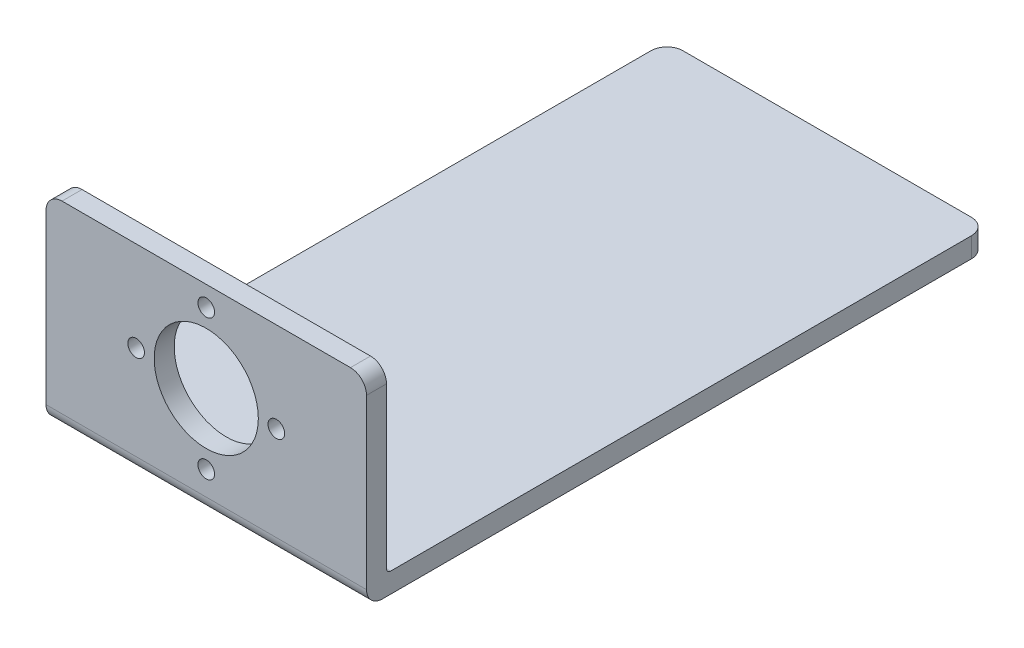
ISO-10303-21;
HEADER;
FILE_DESCRIPTION(('STEP AP214'),'2;1');
FILE_NAME('part.step','',(''),(''),'','','');
FILE_SCHEMA(('AUTOMOTIVE_DESIGN { 1 0 10303 214 1 1 1 1 }'));
ENDSEC;
DATA;
#1=APPLICATION_CONTEXT('core data for automotive mechanical design processes');
#2=APPLICATION_PROTOCOL_DEFINITION('international standard','automotive_design',2000,#1);
#3=PRODUCT_CONTEXT('',#1,'mechanical');
#4=PRODUCT('Part','Part','',(#3));
#5=PRODUCT_RELATED_PRODUCT_CATEGORY('part','',(#4));
#6=PRODUCT_DEFINITION_FORMATION('','',#4);
#7=PRODUCT_DEFINITION_CONTEXT('part definition',#1,'design');
#8=PRODUCT_DEFINITION('design','',#6,#7);
#9=PRODUCT_DEFINITION_SHAPE('','',#8);
#10=(LENGTH_UNIT() NAMED_UNIT(*) SI_UNIT(.MILLI.,.METRE.));
#11=(NAMED_UNIT(*) PLANE_ANGLE_UNIT() SI_UNIT($,.RADIAN.));
#12=(NAMED_UNIT(*) SI_UNIT($,.STERADIAN.) SOLID_ANGLE_UNIT());
#13=UNCERTAINTY_MEASURE_WITH_UNIT(LENGTH_MEASURE(1.E-05),#10,'distance_accuracy_value','');
#14=(GEOMETRIC_REPRESENTATION_CONTEXT(3) GLOBAL_UNCERTAINTY_ASSIGNED_CONTEXT((#13)) GLOBAL_UNIT_ASSIGNED_CONTEXT((#10,
#11,#12)) REPRESENTATION_CONTEXT('',''));
#15=CARTESIAN_POINT('',(0.,0.,0.));
#16=DIRECTION('',(0.,0.,1.));
#17=DIRECTION('',(1.,0.,0.));
#18=AXIS2_PLACEMENT_3D('',#15,#16,#17);
#19=CARTESIAN_POINT('',(0.,0.,5.));
#20=DIRECTION('',(0.,0.,-1.));
#21=DIRECTION('',(-1.,0.,0.));
#22=AXIS2_PLACEMENT_3D('',#19,#20,#21);
#23=PLANE('',#22);
#24=DIRECTION('',(0.,-1.,0.));
#25=VECTOR('',#24,1.);
#26=CARTESIAN_POINT('',(-40.,-22.5,5.));
#27=LINE('',#26,#25);
#28=CARTESIAN_POINT('',(-40.,18.5,5.));
#29=VERTEX_POINT('',#28);
#30=CARTESIAN_POINT('',(-40.,-23.5,5.));
#31=VERTEX_POINT('',#30);
#32=EDGE_CURVE('E195',#29,#31,#27,.T.);
#33=ORIENTED_EDGE('',*,*,#32,.T.);
#34=DIRECTION('',(-1.,0.,0.));
#35=VECTOR('',#34,1.);
#36=CARTESIAN_POINT('',(40.,-23.5,5.));
#37=LINE('',#36,#35);
#38=CARTESIAN_POINT('',(40.,-23.5,5.));
#39=VERTEX_POINT('',#38);
#40=EDGE_CURVE('E128',#31,#39,#37,.F.);
#41=ORIENTED_EDGE('',*,*,#40,.T.);
#42=DIRECTION('',(0.,1.,0.));
#43=VECTOR('',#42,1.);
#44=CARTESIAN_POINT('',(40.,-22.5,5.));
#45=LINE('',#44,#43);
#46=CARTESIAN_POINT('',(40.,18.5,5.));
#47=VERTEX_POINT('',#46);
#48=EDGE_CURVE('E188',#39,#47,#45,.T.);
#49=ORIENTED_EDGE('',*,*,#48,.T.);
#50=CARTESIAN_POINT('',(36.,18.5,5.));
#51=DIRECTION('',(0.,0.,-1.));
#52=DIRECTION('',(-1.,0.,0.));
#53=AXIS2_PLACEMENT_3D('',#50,#51,#52);
#54=CIRCLE('',#53,4.);
#55=CARTESIAN_POINT('',(36.,22.5,5.));
#56=VERTEX_POINT('',#55);
#57=EDGE_CURVE('E133',#47,#56,#54,.F.);
#58=ORIENTED_EDGE('',*,*,#57,.T.);
#59=DIRECTION('',(-1.,0.,0.));
#60=VECTOR('',#59,1.);
#61=CARTESIAN_POINT('',(-40.,22.5,5.));
#62=LINE('',#61,#60);
#63=CARTESIAN_POINT('',(-36.,22.5,5.));
#64=VERTEX_POINT('',#63);
#65=EDGE_CURVE('E191',#56,#64,#62,.T.);
#66=ORIENTED_EDGE('',*,*,#65,.T.);
#67=CARTESIAN_POINT('',(-36.,18.5,5.));
#68=DIRECTION('',(0.,0.,-1.));
#69=DIRECTION('',(-1.,0.,0.));
#70=AXIS2_PLACEMENT_3D('',#67,#68,#69);
#71=CIRCLE('',#70,4.);
#72=EDGE_CURVE('E209',#64,#29,#71,.F.);
#73=ORIENTED_EDGE('',*,*,#72,.T.);
#74=EDGE_LOOP('',(#33,#41,#49,#58,#66,#73));
#75=FACE_BOUND('',#74,.T.);
#76=CARTESIAN_POINT('',(0.,0.,5.));
#77=DIRECTION('',(0.,0.,1.));
#78=DIRECTION('',(1.,0.,0.));
#79=AXIS2_PLACEMENT_3D('',#76,#77,#78);
#80=CIRCLE('',#79,13.);
#81=CARTESIAN_POINT('',(13.,0.,5.));
#82=VERTEX_POINT('',#81);
#83=EDGE_CURVE('E182',#82,#82,#80,.T.);
#84=ORIENTED_EDGE('',*,*,#83,.F.);
#85=EDGE_LOOP('',(#84));
#86=FACE_BOUND('',#85,.T.);
#87=CARTESIAN_POINT('',(0.,17.5,5.));
#88=DIRECTION('',(0.,0.,1.));
#89=DIRECTION('',(1.,0.,0.));
#90=AXIS2_PLACEMENT_3D('',#87,#88,#89);
#91=CIRCLE('',#90,2.075);
#92=CARTESIAN_POINT('',(2.075,17.5,5.));
#93=VERTEX_POINT('',#92);
#94=EDGE_CURVE('E176',#93,#93,#91,.T.);
#95=ORIENTED_EDGE('',*,*,#94,.F.);
#96=EDGE_LOOP('',(#95));
#97=FACE_BOUND('',#96,.T.);
#98=CARTESIAN_POINT('',(17.5000000000005,4.95450781852964E-13,5.));
#99=DIRECTION('',(0.,0.,1.));
#100=DIRECTION('',(1.,0.,0.));
#101=AXIS2_PLACEMENT_3D('',#98,#99,#100);
#102=CIRCLE('',#101,2.07500000000038);
#103=CARTESIAN_POINT('',(19.5750000000009,4.95450781852964E-13,5.));
#104=VERTEX_POINT('',#103);
#105=EDGE_CURVE('E170',#104,#104,#102,.T.);
#106=ORIENTED_EDGE('',*,*,#105,.F.);
#107=EDGE_LOOP('',(#106));
#108=FACE_BOUND('',#107,.T.);
#109=CARTESIAN_POINT('',(9.84838511209777E-13,-17.5,5.));
#110=DIRECTION('',(0.,0.,1.));
#111=DIRECTION('',(1.,0.,0.));
#112=AXIS2_PLACEMENT_3D('',#109,#110,#111);
#113=CIRCLE('',#112,2.07500000000105);
#114=CARTESIAN_POINT('',(2.07500000000204,-17.5,5.));
#115=VERTEX_POINT('',#114);
#116=EDGE_CURVE('E164',#115,#115,#113,.T.);
#117=ORIENTED_EDGE('',*,*,#116,.F.);
#118=EDGE_LOOP('',(#117));
#119=FACE_BOUND('',#118,.T.);
#120=CARTESIAN_POINT('',(-17.4999999999995,-4.97593913751471E-13,5.));
#121=DIRECTION('',(0.,0.,1.));
#122=DIRECTION('',(1.,0.,0.));
#123=AXIS2_PLACEMENT_3D('',#120,#121,#122);
#124=CIRCLE('',#123,2.07500000000078);
#125=CARTESIAN_POINT('',(-15.4249999999987,-4.97593913751471E-13,5.));
#126=VERTEX_POINT('',#125);
#127=EDGE_CURVE('E157',#126,#126,#124,.T.);
#128=ORIENTED_EDGE('',*,*,#127,.F.);
#129=EDGE_LOOP('',(#128));
#130=FACE_BOUND('',#129,.T.);
#131=ADVANCED_FACE('F35',(#75,#86,#97,#108,#119,#130),#23,.F.);
#132=CARTESIAN_POINT('',(0.,0.,0.));
#133=DIRECTION('',(0.,0.,-1.));
#134=DIRECTION('',(-1.,0.,0.));
#135=AXIS2_PLACEMENT_3D('',#132,#133,#134);
#136=PLANE('',#135);
#137=CARTESIAN_POINT('',(9.84838511209777E-13,-17.5,0.));
#138=DIRECTION('',(0.,0.,1.));
#139=DIRECTION('',(1.,0.,0.));
#140=AXIS2_PLACEMENT_3D('',#137,#138,#139);
#141=CIRCLE('',#140,2.07500000000105);
#142=CARTESIAN_POINT('',(2.07500000000204,-17.5,0.));
#143=VERTEX_POINT('',#142);
#144=EDGE_CURVE('E160',#143,#143,#141,.T.);
#145=ORIENTED_EDGE('',*,*,#144,.T.);
#146=EDGE_LOOP('',(#145));
#147=FACE_BOUND('',#146,.T.);
#148=CARTESIAN_POINT('',(0.,17.5,0.));
#149=DIRECTION('',(0.,0.,1.));
#150=DIRECTION('',(1.,0.,0.));
#151=AXIS2_PLACEMENT_3D('',#148,#149,#150);
#152=CIRCLE('',#151,2.075);
#153=CARTESIAN_POINT('',(2.075,17.5,0.));
#154=VERTEX_POINT('',#153);
#155=EDGE_CURVE('E173',#154,#154,#152,.T.);
#156=ORIENTED_EDGE('',*,*,#155,.T.);
#157=EDGE_LOOP('',(#156));
#158=FACE_BOUND('',#157,.T.);
#159=DIRECTION('',(0.,1.,0.));
#160=VECTOR('',#159,1.);
#161=CARTESIAN_POINT('',(40.,-22.5,0.));
#162=LINE('',#161,#160);
#163=CARTESIAN_POINT('',(40.,-21.5,0.));
#164=VERTEX_POINT('',#163);
#165=CARTESIAN_POINT('',(40.,18.5,0.));
#166=VERTEX_POINT('',#165);
#167=EDGE_CURVE('E185',#164,#166,#162,.T.);
#168=ORIENTED_EDGE('',*,*,#167,.F.);
#169=DIRECTION('',(1.,0.,0.));
#170=VECTOR('',#169,1.);
#171=CARTESIAN_POINT('',(-40.,-21.5,0.));
#172=LINE('',#171,#170);
#173=CARTESIAN_POINT('',(-40.,-21.5,0.));
#174=VERTEX_POINT('',#173);
#175=EDGE_CURVE('E56',#164,#174,#172,.F.);
#176=ORIENTED_EDGE('',*,*,#175,.T.);
#177=DIRECTION('',(0.,-1.,0.));
#178=VECTOR('',#177,1.);
#179=CARTESIAN_POINT('',(-40.,-22.5,0.));
#180=LINE('',#179,#178);
#181=CARTESIAN_POINT('',(-40.,18.5,0.));
#182=VERTEX_POINT('',#181);
#183=EDGE_CURVE('E192',#182,#174,#180,.T.);
#184=ORIENTED_EDGE('',*,*,#183,.F.);
#185=CARTESIAN_POINT('',(-36.,18.5,0.));
#186=DIRECTION('',(0.,0.,-1.));
#187=DIRECTION('',(-1.,0.,0.));
#188=AXIS2_PLACEMENT_3D('',#185,#186,#187);
#189=CIRCLE('',#188,4.);
#190=CARTESIAN_POINT('',(-36.,22.5,0.));
#191=VERTEX_POINT('',#190);
#192=EDGE_CURVE('E222',#182,#191,#189,.T.);
#193=ORIENTED_EDGE('',*,*,#192,.T.);
#194=DIRECTION('',(-1.,0.,0.));
#195=VECTOR('',#194,1.);
#196=CARTESIAN_POINT('',(-40.,22.5,0.));
#197=LINE('',#196,#195);
#198=CARTESIAN_POINT('',(36.,22.5,0.));
#199=VERTEX_POINT('',#198);
#200=EDGE_CURVE('E199',#199,#191,#197,.T.);
#201=ORIENTED_EDGE('',*,*,#200,.F.);
#202=CARTESIAN_POINT('',(36.,18.5,0.));
#203=DIRECTION('',(0.,0.,-1.));
#204=DIRECTION('',(-1.,0.,0.));
#205=AXIS2_PLACEMENT_3D('',#202,#203,#204);
#206=CIRCLE('',#205,4.);
#207=EDGE_CURVE('E219',#199,#166,#206,.T.);
#208=ORIENTED_EDGE('',*,*,#207,.T.);
#209=EDGE_LOOP('',(#168,#176,#184,#193,#201,#208));
#210=FACE_BOUND('',#209,.T.);
#211=CARTESIAN_POINT('',(0.,0.,0.));
#212=DIRECTION('',(0.,0.,1.));
#213=DIRECTION('',(1.,0.,0.));
#214=AXIS2_PLACEMENT_3D('',#211,#212,#213);
#215=CIRCLE('',#214,13.);
#216=CARTESIAN_POINT('',(13.,0.,0.));
#217=VERTEX_POINT('',#216);
#218=EDGE_CURVE('E179',#217,#217,#215,.T.);
#219=ORIENTED_EDGE('',*,*,#218,.T.);
#220=EDGE_LOOP('',(#219));
#221=FACE_BOUND('',#220,.T.);
#222=CARTESIAN_POINT('',(17.5000000000005,4.95450781852964E-13,0.));
#223=DIRECTION('',(0.,0.,1.));
#224=DIRECTION('',(1.,0.,0.));
#225=AXIS2_PLACEMENT_3D('',#222,#223,#224);
#226=CIRCLE('',#225,2.07500000000038);
#227=CARTESIAN_POINT('',(19.5750000000009,4.95450781852964E-13,0.));
#228=VERTEX_POINT('',#227);
#229=EDGE_CURVE('E167',#228,#228,#226,.T.);
#230=ORIENTED_EDGE('',*,*,#229,.T.);
#231=EDGE_LOOP('',(#230));
#232=FACE_BOUND('',#231,.T.);
#233=CARTESIAN_POINT('',(-17.4999999999995,-4.97593913751471E-13,0.));
#234=DIRECTION('',(0.,0.,1.));
#235=DIRECTION('',(1.,0.,0.));
#236=AXIS2_PLACEMENT_3D('',#233,#234,#235);
#237=CIRCLE('',#236,2.07500000000078);
#238=CARTESIAN_POINT('',(-15.4249999999987,-4.97593913751471E-13,0.));
#239=VERTEX_POINT('',#238);
#240=EDGE_CURVE('E161',#239,#239,#237,.T.);
#241=ORIENTED_EDGE('',*,*,#240,.T.);
#242=EDGE_LOOP('',(#241));
#243=FACE_BOUND('',#242,.T.);
#244=ADVANCED_FACE('F280',(#147,#158,#210,#221,#232,#243),#136,.T.);
#245=CARTESIAN_POINT('',(40.,-22.5,5.));
#246=DIRECTION('',(-1.,0.,0.));
#247=DIRECTION('',(0.,0.,1.));
#248=AXIS2_PLACEMENT_3D('',#245,#246,#247);
#249=PLANE('',#248);
#250=ORIENTED_EDGE('',*,*,#48,.F.);
#251=CARTESIAN_POINT('',(40.,-23.5,1.));
#252=DIRECTION('',(-1.,0.,0.));
#253=DIRECTION('',(0.,0.,1.));
#254=AXIS2_PLACEMENT_3D('',#251,#252,#253);
#255=CIRCLE('',#254,4.);
#256=CARTESIAN_POINT('',(40.,-27.5,1.));
#257=VERTEX_POINT('',#256);
#258=EDGE_CURVE('E217',#39,#257,#255,.F.);
#259=ORIENTED_EDGE('',*,*,#258,.T.);
#260=DIRECTION('',(0.,0.,-1.));
#261=VECTOR('',#260,1.);
#262=CARTESIAN_POINT('',(40.,-27.5,5.));
#263=LINE('',#262,#261);
#264=CARTESIAN_POINT('',(40.,-27.5,-146.));
#265=VERTEX_POINT('',#264);
#266=EDGE_CURVE('E143',#257,#265,#263,.T.);
#267=ORIENTED_EDGE('',*,*,#266,.T.);
#268=DIRECTION('',(0.,-1.,0.));
#269=VECTOR('',#268,1.);
#270=CARTESIAN_POINT('',(40.,-22.5,-146.));
#271=LINE('',#270,#269);
#272=CARTESIAN_POINT('',(40.,-22.5,-146.));
#273=VERTEX_POINT('',#272);
#274=EDGE_CURVE('E212',#265,#273,#271,.F.);
#275=ORIENTED_EDGE('',*,*,#274,.T.);
#276=DIRECTION('',(0.,0.,-1.));
#277=VECTOR('',#276,1.);
#278=CARTESIAN_POINT('',(40.,-22.5,5.));
#279=LINE('',#278,#277);
#280=CARTESIAN_POINT('',(40.,-22.5,-1.));
#281=VERTEX_POINT('',#280);
#282=EDGE_CURVE('E151',#281,#273,#279,.T.);
#283=ORIENTED_EDGE('',*,*,#282,.F.);
#284=CARTESIAN_POINT('',(40.,-21.5,-1.));
#285=DIRECTION('',(-1.,0.,0.));
#286=DIRECTION('',(0.,0.,1.));
#287=AXIS2_PLACEMENT_3D('',#284,#285,#286);
#288=CIRCLE('',#287,1.);
#289=EDGE_CURVE('E43',#281,#164,#288,.T.);
#290=ORIENTED_EDGE('',*,*,#289,.T.);
#291=ORIENTED_EDGE('',*,*,#167,.T.);
#292=DIRECTION('',(0.,0.,-1.));
#293=VECTOR('',#292,1.);
#294=CARTESIAN_POINT('',(40.,18.5,5.));
#295=LINE('',#294,#293);
#296=EDGE_CURVE('E215',#166,#47,#295,.F.);
#297=ORIENTED_EDGE('',*,*,#296,.T.);
#298=EDGE_LOOP('',(#250,#259,#267,#275,#283,#290,#291,#297));
#299=FACE_BOUND('',#298,.T.);
#300=ADVANCED_FACE('F250',(#299),#249,.F.);
#301=CARTESIAN_POINT('',(-40.,22.5,5.));
#302=DIRECTION('',(0.,-1.,0.));
#303=DIRECTION('',(0.,0.,-1.));
#304=AXIS2_PLACEMENT_3D('',#301,#302,#303);
#305=PLANE('',#304);
#306=ORIENTED_EDGE('',*,*,#200,.T.);
#307=DIRECTION('',(0.,0.,-1.));
#308=VECTOR('',#307,1.);
#309=CARTESIAN_POINT('',(-36.,22.5,5.));
#310=LINE('',#309,#308);
#311=EDGE_CURVE('E227',#191,#64,#310,.F.);
#312=ORIENTED_EDGE('',*,*,#311,.T.);
#313=ORIENTED_EDGE('',*,*,#65,.F.);
#314=DIRECTION('',(0.,0.,-1.));
#315=VECTOR('',#314,1.);
#316=CARTESIAN_POINT('',(36.,22.5,5.));
#317=LINE('',#316,#315);
#318=EDGE_CURVE('E224',#56,#199,#317,.T.);
#319=ORIENTED_EDGE('',*,*,#318,.T.);
#320=EDGE_LOOP('',(#306,#312,#313,#319));
#321=FACE_BOUND('',#320,.T.);
#322=ADVANCED_FACE('F278',(#321),#305,.F.);
#323=CARTESIAN_POINT('',(-40.,-22.5,5.));
#324=DIRECTION('',(1.,0.,0.));
#325=DIRECTION('',(0.,0.,-1.));
#326=AXIS2_PLACEMENT_3D('',#323,#324,#325);
#327=PLANE('',#326);
#328=DIRECTION('',(0.,0.,-1.));
#329=VECTOR('',#328,1.);
#330=CARTESIAN_POINT('',(-40.,-27.5,5.));
#331=LINE('',#330,#329);
#332=CARTESIAN_POINT('',(-40.,-27.5,1.));
#333=VERTEX_POINT('',#332);
#334=CARTESIAN_POINT('',(-40.,-27.5,-146.));
#335=VERTEX_POINT('',#334);
#336=EDGE_CURVE('E140',#333,#335,#331,.T.);
#337=ORIENTED_EDGE('',*,*,#336,.F.);
#338=CARTESIAN_POINT('',(-40.,-23.5,1.));
#339=DIRECTION('',(1.,0.,0.));
#340=DIRECTION('',(0.,0.,-1.));
#341=AXIS2_PLACEMENT_3D('',#338,#339,#340);
#342=CIRCLE('',#341,4.);
#343=EDGE_CURVE('E123',#333,#31,#342,.F.);
#344=ORIENTED_EDGE('',*,*,#343,.T.);
#345=ORIENTED_EDGE('',*,*,#32,.F.);
#346=DIRECTION('',(0.,0.,-1.));
#347=VECTOR('',#346,1.);
#348=CARTESIAN_POINT('',(-40.,18.5,5.));
#349=LINE('',#348,#347);
#350=EDGE_CURVE('E134',#29,#182,#349,.T.);
#351=ORIENTED_EDGE('',*,*,#350,.T.);
#352=ORIENTED_EDGE('',*,*,#183,.T.);
#353=CARTESIAN_POINT('',(-40.,-21.5,-1.));
#354=DIRECTION('',(1.,0.,0.));
#355=DIRECTION('',(0.,0.,-1.));
#356=AXIS2_PLACEMENT_3D('',#353,#354,#355);
#357=CIRCLE('',#356,1.);
#358=CARTESIAN_POINT('',(-40.,-22.5,-1.));
#359=VERTEX_POINT('',#358);
#360=EDGE_CURVE('E11',#174,#359,#357,.T.);
#361=ORIENTED_EDGE('',*,*,#360,.T.);
#362=DIRECTION('',(0.,0.,-1.));
#363=VECTOR('',#362,1.);
#364=CARTESIAN_POINT('',(-40.,-22.5,5.));
#365=LINE('',#364,#363);
#366=CARTESIAN_POINT('',(-40.,-22.5,-146.));
#367=VERTEX_POINT('',#366);
#368=EDGE_CURVE('E149',#359,#367,#365,.T.);
#369=ORIENTED_EDGE('',*,*,#368,.T.);
#370=DIRECTION('',(0.,1.,0.));
#371=VECTOR('',#370,1.);
#372=CARTESIAN_POINT('',(-40.,-27.5,-146.));
#373=LINE('',#372,#371);
#374=EDGE_CURVE('E144',#367,#335,#373,.F.);
#375=ORIENTED_EDGE('',*,*,#374,.T.);
#376=EDGE_LOOP('',(#337,#344,#345,#351,#352,#361,#369,#375));
#377=FACE_BOUND('',#376,.T.);
#378=ADVANCED_FACE('F147',(#377),#327,.F.);
#379=CARTESIAN_POINT('',(0.,0.,5.));
#380=DIRECTION('',(0.,0.,-1.));
#381=DIRECTION('',(-1.,0.,0.));
#382=AXIS2_PLACEMENT_3D('',#379,#380,#381);
#383=CYLINDRICAL_SURFACE('',#382,13.);
#384=ORIENTED_EDGE('',*,*,#83,.T.);
#385=EDGE_LOOP('',(#384));
#386=FACE_BOUND('',#385,.T.);
#387=ORIENTED_EDGE('',*,*,#218,.F.);
#388=EDGE_LOOP('',(#387));
#389=FACE_BOUND('',#388,.T.);
#390=ADVANCED_FACE('F298',(#386,#389),#383,.F.);
#391=CARTESIAN_POINT('',(0.,17.5,5.));
#392=DIRECTION('',(0.,0.,-1.));
#393=DIRECTION('',(-1.,0.,0.));
#394=AXIS2_PLACEMENT_3D('',#391,#392,#393);
#395=CYLINDRICAL_SURFACE('',#394,2.075);
#396=ORIENTED_EDGE('',*,*,#94,.T.);
#397=EDGE_LOOP('',(#396));
#398=FACE_BOUND('',#397,.T.);
#399=ORIENTED_EDGE('',*,*,#155,.F.);
#400=EDGE_LOOP('',(#399));
#401=FACE_BOUND('',#400,.T.);
#402=ADVANCED_FACE('F409',(#398,#401),#395,.F.);
#403=CARTESIAN_POINT('',(17.5000000000005,4.95450781852964E-13,5.));
#404=DIRECTION('',(0.,0.,-1.));
#405=DIRECTION('',(-1.,0.,0.));
#406=AXIS2_PLACEMENT_3D('',#403,#404,#405);
#407=CYLINDRICAL_SURFACE('',#406,2.07500000000038);
#408=ORIENTED_EDGE('',*,*,#105,.T.);
#409=EDGE_LOOP('',(#408));
#410=FACE_BOUND('',#409,.T.);
#411=ORIENTED_EDGE('',*,*,#229,.F.);
#412=EDGE_LOOP('',(#411));
#413=FACE_BOUND('',#412,.T.);
#414=ADVANCED_FACE('F406',(#410,#413),#407,.F.);
#415=CARTESIAN_POINT('',(9.84838511209777E-13,-17.5,5.));
#416=DIRECTION('',(0.,0.,-1.));
#417=DIRECTION('',(-1.,0.,0.));
#418=AXIS2_PLACEMENT_3D('',#415,#416,#417);
#419=CYLINDRICAL_SURFACE('',#418,2.07500000000105);
#420=ORIENTED_EDGE('',*,*,#116,.T.);
#421=EDGE_LOOP('',(#420));
#422=FACE_BOUND('',#421,.T.);
#423=ORIENTED_EDGE('',*,*,#144,.F.);
#424=EDGE_LOOP('',(#423));
#425=FACE_BOUND('',#424,.T.);
#426=ADVANCED_FACE('F403',(#422,#425),#419,.F.);
#427=CARTESIAN_POINT('',(-17.4999999999995,-4.97593913751471E-13,5.));
#428=DIRECTION('',(0.,0.,-1.));
#429=DIRECTION('',(-1.,0.,0.));
#430=AXIS2_PLACEMENT_3D('',#427,#428,#429);
#431=CYLINDRICAL_SURFACE('',#430,2.07500000000078);
#432=ORIENTED_EDGE('',*,*,#127,.T.);
#433=EDGE_LOOP('',(#432));
#434=FACE_BOUND('',#433,.T.);
#435=ORIENTED_EDGE('',*,*,#240,.F.);
#436=EDGE_LOOP('',(#435));
#437=FACE_BOUND('',#436,.T.);
#438=ADVANCED_FACE('F354',(#434,#437),#431,.F.);
#439=CARTESIAN_POINT('',(40.,-22.5,5.));
#440=DIRECTION('',(0.,1.,0.));
#441=DIRECTION('',(0.,0.,1.));
#442=AXIS2_PLACEMENT_3D('',#439,#440,#441);
#443=PLANE('',#442);
#444=ORIENTED_EDGE('',*,*,#368,.F.);
#445=DIRECTION('',(1.,0.,0.));
#446=VECTOR('',#445,1.);
#447=CARTESIAN_POINT('',(40.,-22.5,-1.));
#448=LINE('',#447,#446);
#449=EDGE_CURVE('E240',#359,#281,#448,.T.);
#450=ORIENTED_EDGE('',*,*,#449,.T.);
#451=ORIENTED_EDGE('',*,*,#282,.T.);
#452=CARTESIAN_POINT('',(36.,-22.5,-146.));
#453=DIRECTION('',(0.,1.,0.));
#454=DIRECTION('',(0.,0.,1.));
#455=AXIS2_PLACEMENT_3D('',#452,#453,#454);
#456=CIRCLE('',#455,4.);
#457=CARTESIAN_POINT('',(36.,-22.5,-150.));
#458=VERTEX_POINT('',#457);
#459=EDGE_CURVE('E235',#273,#458,#456,.T.);
#460=ORIENTED_EDGE('',*,*,#459,.T.);
#461=DIRECTION('',(1.,0.,0.));
#462=VECTOR('',#461,1.);
#463=CARTESIAN_POINT('',(40.,-22.5,-150.));
#464=LINE('',#463,#462);
#465=CARTESIAN_POINT('',(-36.,-22.5,-150.));
#466=VERTEX_POINT('',#465);
#467=EDGE_CURVE('E153',#466,#458,#464,.T.);
#468=ORIENTED_EDGE('',*,*,#467,.F.);
#469=CARTESIAN_POINT('',(-36.,-22.5,-146.));
#470=DIRECTION('',(0.,1.,0.));
#471=DIRECTION('',(0.,0.,1.));
#472=AXIS2_PLACEMENT_3D('',#469,#470,#471);
#473=CIRCLE('',#472,4.);
#474=EDGE_CURVE('E237',#466,#367,#473,.T.);
#475=ORIENTED_EDGE('',*,*,#474,.T.);
#476=EDGE_LOOP('',(#444,#450,#451,#460,#468,#475));
#477=FACE_BOUND('',#476,.T.);
#478=ADVANCED_FACE('F246',(#477),#443,.T.);
#479=CARTESIAN_POINT('',(40.,-27.5,5.));
#480=DIRECTION('',(0.,-1.,0.));
#481=DIRECTION('',(0.,0.,-1.));
#482=AXIS2_PLACEMENT_3D('',#479,#480,#481);
#483=PLANE('',#482);
#484=ORIENTED_EDGE('',*,*,#266,.F.);
#485=DIRECTION('',(-1.,0.,0.));
#486=VECTOR('',#485,1.);
#487=CARTESIAN_POINT('',(-40.,-27.5,1.));
#488=LINE('',#487,#486);
#489=EDGE_CURVE('E127',#257,#333,#488,.T.);
#490=ORIENTED_EDGE('',*,*,#489,.T.);
#491=ORIENTED_EDGE('',*,*,#336,.T.);
#492=CARTESIAN_POINT('',(-36.,-27.5,-146.));
#493=DIRECTION('',(0.,-1.,0.));
#494=DIRECTION('',(0.,0.,-1.));
#495=AXIS2_PLACEMENT_3D('',#492,#493,#494);
#496=CIRCLE('',#495,4.);
#497=CARTESIAN_POINT('',(-36.,-27.5,-150.));
#498=VERTEX_POINT('',#497);
#499=EDGE_CURVE('E145',#335,#498,#496,.T.);
#500=ORIENTED_EDGE('',*,*,#499,.T.);
#501=DIRECTION('',(-1.,0.,0.));
#502=VECTOR('',#501,1.);
#503=CARTESIAN_POINT('',(40.,-27.5,-150.));
#504=LINE('',#503,#502);
#505=CARTESIAN_POINT('',(36.,-27.5,-150.));
#506=VERTEX_POINT('',#505);
#507=EDGE_CURVE('E256',#506,#498,#504,.T.);
#508=ORIENTED_EDGE('',*,*,#507,.F.);
#509=CARTESIAN_POINT('',(36.,-27.5,-146.));
#510=DIRECTION('',(0.,-1.,0.));
#511=DIRECTION('',(0.,0.,-1.));
#512=AXIS2_PLACEMENT_3D('',#509,#510,#511);
#513=CIRCLE('',#512,4.);
#514=EDGE_CURVE('E197',#506,#265,#513,.T.);
#515=ORIENTED_EDGE('',*,*,#514,.T.);
#516=EDGE_LOOP('',(#484,#490,#491,#500,#508,#515));
#517=FACE_BOUND('',#516,.T.);
#518=ADVANCED_FACE('F139',(#517),#483,.T.);
#519=CARTESIAN_POINT('',(0.,0.,-150.));
#520=DIRECTION('',(0.,0.,-1.));
#521=DIRECTION('',(-1.,0.,0.));
#522=AXIS2_PLACEMENT_3D('',#519,#520,#521);
#523=PLANE('',#522);
#524=ORIENTED_EDGE('',*,*,#507,.T.);
#525=DIRECTION('',(0.,1.,0.));
#526=VECTOR('',#525,1.);
#527=CARTESIAN_POINT('',(-36.,-22.5,-150.));
#528=LINE('',#527,#526);
#529=EDGE_CURVE('E232',#498,#466,#528,.T.);
#530=ORIENTED_EDGE('',*,*,#529,.T.);
#531=ORIENTED_EDGE('',*,*,#467,.T.);
#532=DIRECTION('',(0.,-1.,0.));
#533=VECTOR('',#532,1.);
#534=CARTESIAN_POINT('',(36.,-27.5,-150.));
#535=LINE('',#534,#533);
#536=EDGE_CURVE('E229',#458,#506,#535,.T.);
#537=ORIENTED_EDGE('',*,*,#536,.T.);
#538=EDGE_LOOP('',(#524,#530,#531,#537));
#539=FACE_BOUND('',#538,.T.);
#540=ADVANCED_FACE('F261',(#539),#523,.T.);
#541=CARTESIAN_POINT('',(40.,-23.5,1.));
#542=DIRECTION('',(1.,0.,0.));
#543=DIRECTION('',(0.,0.,-1.));
#544=AXIS2_PLACEMENT_3D('',#541,#542,#543);
#545=CYLINDRICAL_SURFACE('',#544,4.);
#546=ORIENTED_EDGE('',*,*,#258,.F.);
#547=ORIENTED_EDGE('',*,*,#40,.F.);
#548=ORIENTED_EDGE('',*,*,#343,.F.);
#549=ORIENTED_EDGE('',*,*,#489,.F.);
#550=EDGE_LOOP('',(#546,#547,#548,#549));
#551=FACE_BOUND('',#550,.T.);
#552=ADVANCED_FACE('F126',(#551),#545,.T.);
#553=CARTESIAN_POINT('',(-36.,18.5,5.));
#554=DIRECTION('',(0.,0.,-1.));
#555=DIRECTION('',(-1.,0.,0.));
#556=AXIS2_PLACEMENT_3D('',#553,#554,#555);
#557=CYLINDRICAL_SURFACE('',#556,4.);
#558=ORIENTED_EDGE('',*,*,#72,.F.);
#559=ORIENTED_EDGE('',*,*,#311,.F.);
#560=ORIENTED_EDGE('',*,*,#192,.F.);
#561=ORIENTED_EDGE('',*,*,#350,.F.);
#562=EDGE_LOOP('',(#558,#559,#560,#561));
#563=FACE_BOUND('',#562,.T.);
#564=ADVANCED_FACE('F285',(#563),#557,.T.);
#565=CARTESIAN_POINT('',(36.,18.5,5.));
#566=DIRECTION('',(0.,0.,-1.));
#567=DIRECTION('',(-1.,0.,0.));
#568=AXIS2_PLACEMENT_3D('',#565,#566,#567);
#569=CYLINDRICAL_SURFACE('',#568,4.);
#570=ORIENTED_EDGE('',*,*,#57,.F.);
#571=ORIENTED_EDGE('',*,*,#296,.F.);
#572=ORIENTED_EDGE('',*,*,#207,.F.);
#573=ORIENTED_EDGE('',*,*,#318,.F.);
#574=EDGE_LOOP('',(#570,#571,#572,#573));
#575=FACE_BOUND('',#574,.T.);
#576=ADVANCED_FACE('F275',(#575),#569,.T.);
#577=CARTESIAN_POINT('',(-36.,0.,-146.));
#578=DIRECTION('',(0.,-1.,0.));
#579=DIRECTION('',(0.,0.,-1.));
#580=AXIS2_PLACEMENT_3D('',#577,#578,#579);
#581=CYLINDRICAL_SURFACE('',#580,4.);
#582=ORIENTED_EDGE('',*,*,#499,.F.);
#583=ORIENTED_EDGE('',*,*,#374,.F.);
#584=ORIENTED_EDGE('',*,*,#474,.F.);
#585=ORIENTED_EDGE('',*,*,#529,.F.);
#586=EDGE_LOOP('',(#582,#583,#584,#585));
#587=FACE_BOUND('',#586,.T.);
#588=ADVANCED_FACE('F265',(#587),#581,.T.);
#589=CARTESIAN_POINT('',(36.,0.,-146.));
#590=DIRECTION('',(0.,1.,0.));
#591=DIRECTION('',(0.,0.,1.));
#592=AXIS2_PLACEMENT_3D('',#589,#590,#591);
#593=CYLINDRICAL_SURFACE('',#592,4.);
#594=ORIENTED_EDGE('',*,*,#459,.F.);
#595=ORIENTED_EDGE('',*,*,#274,.F.);
#596=ORIENTED_EDGE('',*,*,#514,.F.);
#597=ORIENTED_EDGE('',*,*,#536,.F.);
#598=EDGE_LOOP('',(#594,#595,#596,#597));
#599=FACE_BOUND('',#598,.T.);
#600=ADVANCED_FACE('F267',(#599),#593,.T.);
#601=CARTESIAN_POINT('',(40.,-21.5,-1.));
#602=DIRECTION('',(-1.,0.,0.));
#603=DIRECTION('',(0.,0.,1.));
#604=AXIS2_PLACEMENT_3D('',#601,#602,#603);
#605=CYLINDRICAL_SURFACE('',#604,1.);
#606=ORIENTED_EDGE('',*,*,#360,.F.);
#607=ORIENTED_EDGE('',*,*,#175,.F.);
#608=ORIENTED_EDGE('',*,*,#289,.F.);
#609=ORIENTED_EDGE('',*,*,#449,.F.);
#610=EDGE_LOOP('',(#606,#607,#608,#609));
#611=FACE_BOUND('',#610,.T.);
#612=ADVANCED_FACE('F37',(#611),#605,.F.);
#613=CLOSED_SHELL('',(#131,#244,#300,#322,#378,#390,#402,#414,#426,#438,#478,#518,#540,#552,
#564,#576,#588,#600,#612));
#614=MANIFOLD_SOLID_BREP('B2',#613);
#615=ADVANCED_BREP_SHAPE_REPRESENTATION('',(#18,#614),#14);
#616=SHAPE_DEFINITION_REPRESENTATION(#9,#615);
ENDSEC;
END-ISO-10303-21;
